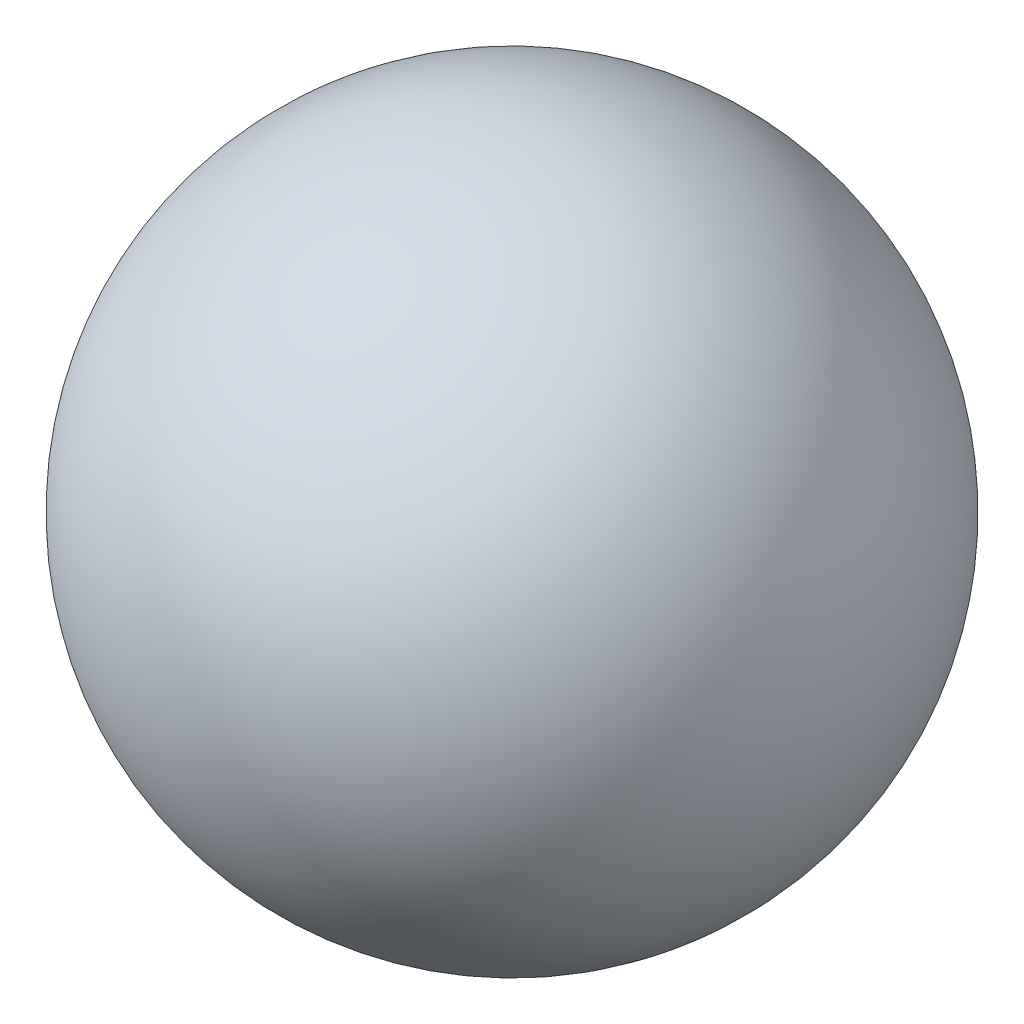
ISO-10303-21;
HEADER;
FILE_DESCRIPTION(('STEP AP214'),'2;1');
FILE_NAME('part.step','',(''),(''),'','','');
FILE_SCHEMA(('AUTOMOTIVE_DESIGN { 1 0 10303 214 1 1 1 1 }'));
ENDSEC;
DATA;
#1=APPLICATION_CONTEXT('core data for automotive mechanical design processes');
#2=APPLICATION_PROTOCOL_DEFINITION('international standard','automotive_design',2000,#1);
#3=PRODUCT_CONTEXT('',#1,'mechanical');
#4=PRODUCT('Part','Part','',(#3));
#5=PRODUCT_RELATED_PRODUCT_CATEGORY('part','',(#4));
#6=PRODUCT_DEFINITION_FORMATION('','',#4);
#7=PRODUCT_DEFINITION_CONTEXT('part definition',#1,'design');
#8=PRODUCT_DEFINITION('design','',#6,#7);
#9=PRODUCT_DEFINITION_SHAPE('','',#8);
#10=(LENGTH_UNIT() NAMED_UNIT(*) SI_UNIT(.MILLI.,.METRE.));
#11=(NAMED_UNIT(*) PLANE_ANGLE_UNIT() SI_UNIT($,.RADIAN.));
#12=(NAMED_UNIT(*) SI_UNIT($,.STERADIAN.) SOLID_ANGLE_UNIT());
#13=UNCERTAINTY_MEASURE_WITH_UNIT(LENGTH_MEASURE(1.E-05),#10,'distance_accuracy_value','');
#14=(GEOMETRIC_REPRESENTATION_CONTEXT(3) GLOBAL_UNCERTAINTY_ASSIGNED_CONTEXT((#13)) GLOBAL_UNIT_ASSIGNED_CONTEXT((#10,
#11,#12)) REPRESENTATION_CONTEXT('',''));
#15=CARTESIAN_POINT('',(0.,0.,0.));
#16=DIRECTION('',(0.,0.,1.));
#17=DIRECTION('',(1.,0.,0.));
#18=AXIS2_PLACEMENT_3D('',#15,#16,#17);
#19=CARTESIAN_POINT('',(1.98437499999998,-3.4370383212695,0.));
#20=DIRECTION('',(0.499999999999995,-0.866025403784442,0.));
#21=DIRECTION('',(0.866025403784442,0.499999999999995,0.));
#22=AXIS2_PLACEMENT_3D('',#19,#20,#21);
#23=SPHERICAL_SURFACE('',#22,0.758760243513404);
#24=CARTESIAN_POINT('',(2.36375512175668,-4.09414396753378,0.));
#25=VERTEX_POINT('',#24);
#26=VERTEX_LOOP('',#25);
#27=FACE_BOUND('',#26,.T.);
#28=ADVANCED_FACE('F34',(#27),#23,.T.);
#29=CLOSED_SHELL('',(#28));
#30=MANIFOLD_SOLID_BREP('B2',#29);
#31=ADVANCED_BREP_SHAPE_REPRESENTATION('',(#18,#30),#14);
#32=SHAPE_DEFINITION_REPRESENTATION(#9,#31);
ENDSEC;
END-ISO-10303-21;
